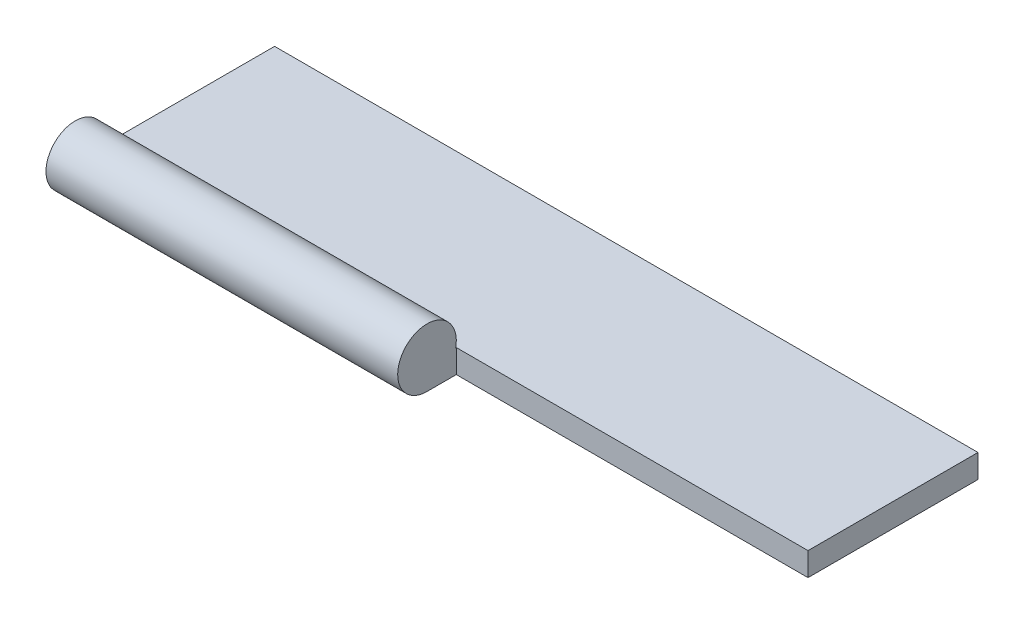
ISO-10303-21;
HEADER;
FILE_DESCRIPTION(('STEP AP214'),'2;1');
FILE_NAME('part.step','',(''),(''),'','','');
FILE_SCHEMA(('AUTOMOTIVE_DESIGN { 1 0 10303 214 1 1 1 1 }'));
ENDSEC;
DATA;
#1=APPLICATION_CONTEXT('core data for automotive mechanical design processes');
#2=APPLICATION_PROTOCOL_DEFINITION('international standard','automotive_design',2000,#1);
#3=PRODUCT_CONTEXT('',#1,'mechanical');
#4=PRODUCT('Part','Part','',(#3));
#5=PRODUCT_RELATED_PRODUCT_CATEGORY('part','',(#4));
#6=PRODUCT_DEFINITION_FORMATION('','',#4);
#7=PRODUCT_DEFINITION_CONTEXT('part definition',#1,'design');
#8=PRODUCT_DEFINITION('design','',#6,#7);
#9=PRODUCT_DEFINITION_SHAPE('','',#8);
#10=(LENGTH_UNIT() NAMED_UNIT(*) SI_UNIT(.MILLI.,.METRE.));
#11=(NAMED_UNIT(*) PLANE_ANGLE_UNIT() SI_UNIT($,.RADIAN.));
#12=(NAMED_UNIT(*) SI_UNIT($,.STERADIAN.) SOLID_ANGLE_UNIT());
#13=UNCERTAINTY_MEASURE_WITH_UNIT(LENGTH_MEASURE(1.E-05),#10,'distance_accuracy_value','');
#14=(GEOMETRIC_REPRESENTATION_CONTEXT(3) GLOBAL_UNCERTAINTY_ASSIGNED_CONTEXT((#13)) GLOBAL_UNIT_ASSIGNED_CONTEXT((#10,
#11,#12)) REPRESENTATION_CONTEXT('',''));
#15=CARTESIAN_POINT('',(0.,0.,0.));
#16=DIRECTION('',(0.,0.,1.));
#17=DIRECTION('',(1.,0.,0.));
#18=AXIS2_PLACEMENT_3D('',#15,#16,#17);
#19=CARTESIAN_POINT('',(60.,0.,0.));
#20=DIRECTION('',(-1.,0.,0.));
#21=DIRECTION('',(0.,0.,1.));
#22=AXIS2_PLACEMENT_3D('',#19,#20,#21);
#23=CYLINDRICAL_SURFACE('',#22,2.5);
#24=CARTESIAN_POINT('',(30.,0.,0.));
#25=DIRECTION('',(-1.,0.,0.));
#26=DIRECTION('',(0.,0.,1.));
#27=AXIS2_PLACEMENT_3D('',#24,#25,#26);
#28=CIRCLE('',#27,2.5);
#29=CARTESIAN_POINT('',(30.,-2.5,0.));
#30=VERTEX_POINT('',#29);
#31=CARTESIAN_POINT('',(30.,-0.500000000000002,-2.44948974278318));
#32=VERTEX_POINT('',#31);
#33=EDGE_CURVE('E82',#30,#32,#28,.T.);
#34=ORIENTED_EDGE('',*,*,#33,.T.);
#35=DIRECTION('',(-1.,0.,0.));
#36=VECTOR('',#35,1.);
#37=CARTESIAN_POINT('',(60.,-0.500000000000002,-2.44948974278318));
#38=LINE('',#37,#36);
#39=CARTESIAN_POINT('',(0.,-0.500000000000002,-2.44948974278318));
#40=VERTEX_POINT('',#39);
#41=EDGE_CURVE('E76',#32,#40,#38,.T.);
#42=ORIENTED_EDGE('',*,*,#41,.T.);
#43=CARTESIAN_POINT('',(0.,0.,0.));
#44=DIRECTION('',(1.,0.,0.));
#45=DIRECTION('',(0.,0.,-1.));
#46=AXIS2_PLACEMENT_3D('',#43,#44,#45);
#47=CIRCLE('',#46,2.5);
#48=CARTESIAN_POINT('',(0.,-2.5,0.));
#49=VERTEX_POINT('',#48);
#50=EDGE_CURVE('E80',#40,#49,#47,.T.);
#51=ORIENTED_EDGE('',*,*,#50,.T.);
#52=DIRECTION('',(-1.,0.,0.));
#53=VECTOR('',#52,1.);
#54=CARTESIAN_POINT('',(60.,-2.5,0.));
#55=LINE('',#54,#53);
#56=EDGE_CURVE('E113',#30,#49,#55,.T.);
#57=ORIENTED_EDGE('',*,*,#56,.F.);
#58=EDGE_LOOP('',(#34,#42,#51,#57));
#59=FACE_BOUND('',#58,.T.);
#60=ADVANCED_FACE('F33',(#59),#23,.T.);
#61=CARTESIAN_POINT('',(60.,-2.5,0.));
#62=DIRECTION('',(0.,1.,0.));
#63=DIRECTION('',(0.,0.,1.));
#64=AXIS2_PLACEMENT_3D('',#61,#62,#63);
#65=PLANE('',#64);
#66=DIRECTION('',(0.,0.,-1.));
#67=VECTOR('',#66,1.);
#68=CARTESIAN_POINT('',(60.,-2.5,0.));
#69=LINE('',#68,#67);
#70=CARTESIAN_POINT('',(60.,-2.5,-2.5));
#71=VERTEX_POINT('',#70);
#72=CARTESIAN_POINT('',(60.,-2.5,-17.));
#73=VERTEX_POINT('',#72);
#74=EDGE_CURVE('E95',#71,#73,#69,.T.);
#75=ORIENTED_EDGE('',*,*,#74,.F.);
#76=DIRECTION('',(1.,0.,0.));
#77=VECTOR('',#76,1.);
#78=CARTESIAN_POINT('',(30.,-2.5,-2.5));
#79=LINE('',#78,#77);
#80=CARTESIAN_POINT('',(30.,-2.5,-2.5));
#81=VERTEX_POINT('',#80);
#82=EDGE_CURVE('E47',#81,#71,#79,.T.);
#83=ORIENTED_EDGE('',*,*,#82,.F.);
#84=DIRECTION('',(0.,0.,-1.));
#85=VECTOR('',#84,1.);
#86=CARTESIAN_POINT('',(30.,-2.5,2.5));
#87=LINE('',#86,#85);
#88=EDGE_CURVE('E129',#30,#81,#87,.T.);
#89=ORIENTED_EDGE('',*,*,#88,.F.);
#90=ORIENTED_EDGE('',*,*,#56,.T.);
#91=DIRECTION('',(0.,0.,-1.));
#92=VECTOR('',#91,1.);
#93=CARTESIAN_POINT('',(0.,-2.5,0.));
#94=LINE('',#93,#92);
#95=CARTESIAN_POINT('',(0.,-2.5,-17.));
#96=VERTEX_POINT('',#95);
#97=EDGE_CURVE('E100',#49,#96,#94,.T.);
#98=ORIENTED_EDGE('',*,*,#97,.T.);
#99=DIRECTION('',(-1.,0.,0.));
#100=VECTOR('',#99,1.);
#101=CARTESIAN_POINT('',(60.,-2.5,-17.));
#102=LINE('',#101,#100);
#103=EDGE_CURVE('E110',#73,#96,#102,.T.);
#104=ORIENTED_EDGE('',*,*,#103,.F.);
#105=EDGE_LOOP('',(#75,#83,#89,#90,#98,#104));
#106=FACE_BOUND('',#105,.T.);
#107=ADVANCED_FACE('F138',(#106),#65,.F.);
#108=CARTESIAN_POINT('',(60.,-2.5,-17.));
#109=DIRECTION('',(0.,0.,1.));
#110=DIRECTION('',(1.,0.,0.));
#111=AXIS2_PLACEMENT_3D('',#108,#109,#110);
#112=PLANE('',#111);
#113=DIRECTION('',(0.,1.,0.));
#114=VECTOR('',#113,1.);
#115=CARTESIAN_POINT('',(0.,-2.5,-17.));
#116=LINE('',#115,#114);
#117=CARTESIAN_POINT('',(0.,-0.5,-17.));
#118=VERTEX_POINT('',#117);
#119=EDGE_CURVE('E96',#96,#118,#116,.T.);
#120=ORIENTED_EDGE('',*,*,#119,.T.);
#121=DIRECTION('',(-1.,0.,0.));
#122=VECTOR('',#121,1.);
#123=CARTESIAN_POINT('',(60.,-0.5,-17.));
#124=LINE('',#123,#122);
#125=CARTESIAN_POINT('',(60.,-0.5,-17.));
#126=VERTEX_POINT('',#125);
#127=EDGE_CURVE('E85',#126,#118,#124,.T.);
#128=ORIENTED_EDGE('',*,*,#127,.F.);
#129=DIRECTION('',(0.,1.,0.));
#130=VECTOR('',#129,1.);
#131=CARTESIAN_POINT('',(60.,-2.5,-17.));
#132=LINE('',#131,#130);
#133=EDGE_CURVE('E56',#73,#126,#132,.T.);
#134=ORIENTED_EDGE('',*,*,#133,.F.);
#135=ORIENTED_EDGE('',*,*,#103,.T.);
#136=EDGE_LOOP('',(#120,#128,#134,#135));
#137=FACE_BOUND('',#136,.T.);
#138=ADVANCED_FACE('F141',(#137),#112,.F.);
#139=CARTESIAN_POINT('',(60.,-0.5,-17.));
#140=DIRECTION('',(0.,-1.,0.));
#141=DIRECTION('',(0.,0.,-1.));
#142=AXIS2_PLACEMENT_3D('',#139,#140,#141);
#143=PLANE('',#142);
#144=DIRECTION('',(0.,0.,-1.));
#145=VECTOR('',#144,1.);
#146=CARTESIAN_POINT('',(30.,-0.5,-17.));
#147=LINE('',#146,#145);
#148=CARTESIAN_POINT('',(30.,-0.500000000000002,-2.5));
#149=VERTEX_POINT('',#148);
#150=EDGE_CURVE('E11',#32,#149,#147,.T.);
#151=ORIENTED_EDGE('',*,*,#150,.T.);
#152=DIRECTION('',(1.,0.,0.));
#153=VECTOR('',#152,1.);
#154=CARTESIAN_POINT('',(60.,-0.500000000000002,-2.5));
#155=LINE('',#154,#153);
#156=CARTESIAN_POINT('',(60.,-0.500000000000001,-2.5));
#157=VERTEX_POINT('',#156);
#158=EDGE_CURVE('E103',#149,#157,#155,.T.);
#159=ORIENTED_EDGE('',*,*,#158,.T.);
#160=DIRECTION('',(0.,0.,1.));
#161=VECTOR('',#160,1.);
#162=CARTESIAN_POINT('',(60.,-0.5,-17.));
#163=LINE('',#162,#161);
#164=EDGE_CURVE('E86',#126,#157,#163,.T.);
#165=ORIENTED_EDGE('',*,*,#164,.F.);
#166=ORIENTED_EDGE('',*,*,#127,.T.);
#167=DIRECTION('',(0.,0.,1.));
#168=VECTOR('',#167,1.);
#169=CARTESIAN_POINT('',(0.,-0.5,-17.));
#170=LINE('',#169,#168);
#171=EDGE_CURVE('E90',#118,#40,#170,.T.);
#172=ORIENTED_EDGE('',*,*,#171,.T.);
#173=ORIENTED_EDGE('',*,*,#41,.F.);
#174=EDGE_LOOP('',(#151,#159,#165,#166,#172,#173));
#175=FACE_BOUND('',#174,.T.);
#176=ADVANCED_FACE('F91',(#175),#143,.F.);
#177=CARTESIAN_POINT('',(60.,0.,0.));
#178=DIRECTION('',(1.,0.,0.));
#179=DIRECTION('',(0.,0.,-1.));
#180=AXIS2_PLACEMENT_3D('',#177,#178,#179);
#181=PLANE('',#180);
#182=DIRECTION('',(0.,1.,0.));
#183=VECTOR('',#182,1.);
#184=CARTESIAN_POINT('',(60.,0.,-2.5));
#185=LINE('',#184,#183);
#186=EDGE_CURVE('E40',#71,#157,#185,.T.);
#187=ORIENTED_EDGE('',*,*,#186,.F.);
#188=ORIENTED_EDGE('',*,*,#74,.T.);
#189=ORIENTED_EDGE('',*,*,#133,.T.);
#190=ORIENTED_EDGE('',*,*,#164,.T.);
#191=EDGE_LOOP('',(#187,#188,#189,#190));
#192=FACE_BOUND('',#191,.T.);
#193=ADVANCED_FACE('F124',(#192),#181,.T.);
#194=CARTESIAN_POINT('',(0.,0.,0.));
#195=DIRECTION('',(1.,0.,0.));
#196=DIRECTION('',(0.,0.,-1.));
#197=AXIS2_PLACEMENT_3D('',#194,#195,#196);
#198=PLANE('',#197);
#199=ORIENTED_EDGE('',*,*,#50,.F.);
#200=ORIENTED_EDGE('',*,*,#171,.F.);
#201=ORIENTED_EDGE('',*,*,#119,.F.);
#202=ORIENTED_EDGE('',*,*,#97,.F.);
#203=EDGE_LOOP('',(#199,#200,#201,#202));
#204=FACE_BOUND('',#203,.T.);
#205=ADVANCED_FACE('F99',(#204),#198,.F.);
#206=CARTESIAN_POINT('',(30.,2.5,2.5));
#207=DIRECTION('',(-1.,0.,0.));
#208=DIRECTION('',(0.,0.,1.));
#209=AXIS2_PLACEMENT_3D('',#206,#207,#208);
#210=PLANE('',#209);
#211=ORIENTED_EDGE('',*,*,#88,.T.);
#212=DIRECTION('',(0.,-1.,0.));
#213=VECTOR('',#212,1.);
#214=CARTESIAN_POINT('',(30.,2.5,-2.5));
#215=LINE('',#214,#213);
#216=EDGE_CURVE('E122',#149,#81,#215,.T.);
#217=ORIENTED_EDGE('',*,*,#216,.F.);
#218=ORIENTED_EDGE('',*,*,#150,.F.);
#219=ORIENTED_EDGE('',*,*,#33,.F.);
#220=EDGE_LOOP('',(#211,#217,#218,#219));
#221=FACE_BOUND('',#220,.T.);
#222=ADVANCED_FACE('F134',(#221),#210,.F.);
#223=CARTESIAN_POINT('',(30.,2.5,-2.5));
#224=DIRECTION('',(0.,0.,-1.));
#225=DIRECTION('',(-1.,0.,0.));
#226=AXIS2_PLACEMENT_3D('',#223,#224,#225);
#227=PLANE('',#226);
#228=ORIENTED_EDGE('',*,*,#216,.T.);
#229=ORIENTED_EDGE('',*,*,#82,.T.);
#230=ORIENTED_EDGE('',*,*,#186,.T.);
#231=ORIENTED_EDGE('',*,*,#158,.F.);
#232=EDGE_LOOP('',(#228,#229,#230,#231));
#233=FACE_BOUND('',#232,.T.);
#234=ADVANCED_FACE('F117',(#233),#227,.F.);
#235=CLOSED_SHELL('',(#60,#107,#138,#176,#193,#205,#222,#234));
#236=MANIFOLD_SOLID_BREP('B2',#235);
#237=ADVANCED_BREP_SHAPE_REPRESENTATION('',(#18,#236),#14);
#238=SHAPE_DEFINITION_REPRESENTATION(#9,#237);
ENDSEC;
END-ISO-10303-21;
